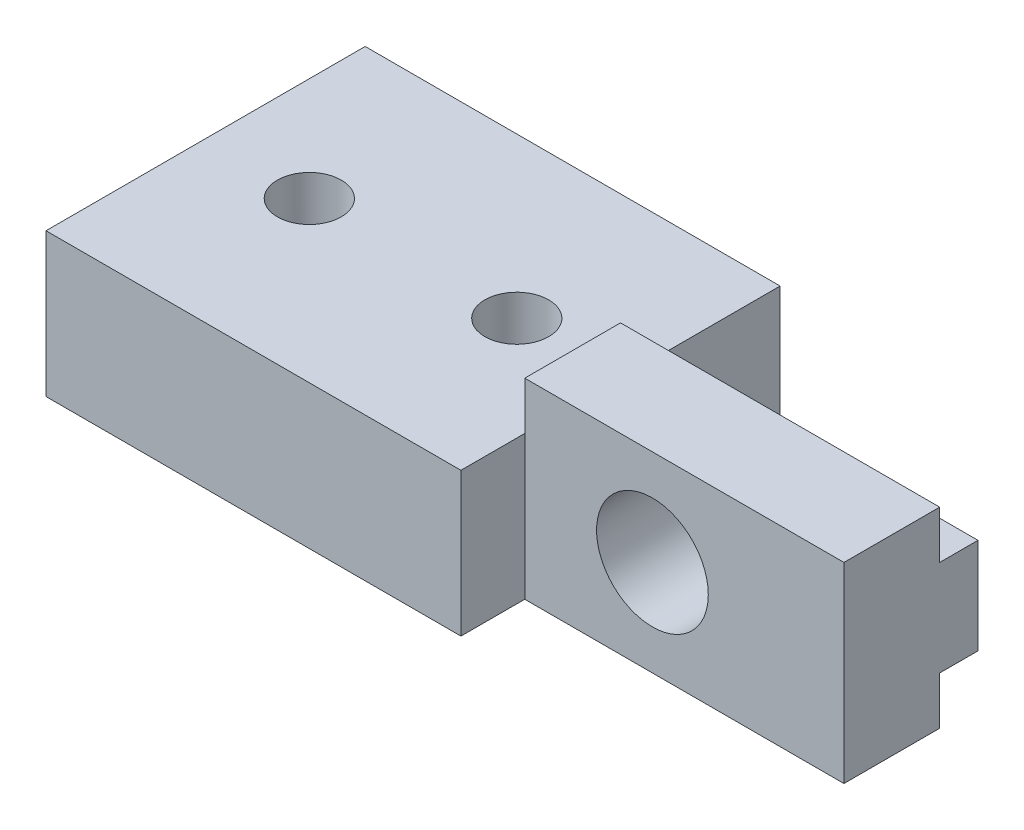
ISO-10303-21;
HEADER;
FILE_DESCRIPTION(('STEP AP214'),'2;1');
FILE_NAME('part.step','',(''),(''),'','','');
FILE_SCHEMA(('AUTOMOTIVE_DESIGN { 1 0 10303 214 1 1 1 1 }'));
ENDSEC;
DATA;
#1=APPLICATION_CONTEXT('core data for automotive mechanical design processes');
#2=APPLICATION_PROTOCOL_DEFINITION('international standard','automotive_design',2000,#1);
#3=PRODUCT_CONTEXT('',#1,'mechanical');
#4=PRODUCT('Part','Part','',(#3));
#5=PRODUCT_RELATED_PRODUCT_CATEGORY('part','',(#4));
#6=PRODUCT_DEFINITION_FORMATION('','',#4);
#7=PRODUCT_DEFINITION_CONTEXT('part definition',#1,'design');
#8=PRODUCT_DEFINITION('design','',#6,#7);
#9=PRODUCT_DEFINITION_SHAPE('','',#8);
#10=(LENGTH_UNIT() NAMED_UNIT(*) SI_UNIT(.MILLI.,.METRE.));
#11=(NAMED_UNIT(*) PLANE_ANGLE_UNIT() SI_UNIT($,.RADIAN.));
#12=(NAMED_UNIT(*) SI_UNIT($,.STERADIAN.) SOLID_ANGLE_UNIT());
#13=UNCERTAINTY_MEASURE_WITH_UNIT(LENGTH_MEASURE(1.E-05),#10,'distance_accuracy_value','');
#14=(GEOMETRIC_REPRESENTATION_CONTEXT(3) GLOBAL_UNCERTAINTY_ASSIGNED_CONTEXT((#13)) GLOBAL_UNIT_ASSIGNED_CONTEXT((#10,
#11,#12)) REPRESENTATION_CONTEXT('',''));
#15=CARTESIAN_POINT('',(0.,0.,0.));
#16=DIRECTION('',(0.,0.,1.));
#17=DIRECTION('',(1.,0.,0.));
#18=AXIS2_PLACEMENT_3D('',#15,#16,#17);
#19=CARTESIAN_POINT('',(16.5,1.5,-1.2));
#20=DIRECTION('',(0.,1.,0.));
#21=DIRECTION('',(0.,0.,1.));
#22=AXIS2_PLACEMENT_3D('',#19,#20,#21);
#23=PLANE('',#22);
#24=DIRECTION('',(-1.,0.,0.));
#25=VECTOR('',#24,1.);
#26=CARTESIAN_POINT('',(16.5,1.5,-1.2));
#27=LINE('',#26,#25);
#28=CARTESIAN_POINT('',(9.598612181134,1.5,-1.2));
#29=VERTEX_POINT('',#28);
#30=CARTESIAN_POINT('',(6.5,1.5,-1.2));
#31=VERTEX_POINT('',#30);
#32=EDGE_CURVE('E63',#29,#31,#27,.T.);
#33=ORIENTED_EDGE('',*,*,#32,.F.);
#34=DIRECTION('',(0.,0.,1.));
#35=VECTOR('',#34,1.);
#36=CARTESIAN_POINT('',(9.598612181134,1.5,-5.));
#37=LINE('',#36,#35);
#38=CARTESIAN_POINT('',(9.598612181134,1.5,0.));
#39=VERTEX_POINT('',#38);
#40=EDGE_CURVE('E321',#29,#39,#37,.T.);
#41=ORIENTED_EDGE('',*,*,#40,.T.);
#42=DIRECTION('',(-1.,0.,0.));
#43=VECTOR('',#42,1.);
#44=CARTESIAN_POINT('',(16.5,1.5,0.));
#45=LINE('',#44,#43);
#46=CARTESIAN_POINT('',(6.5,1.5,0.));
#47=VERTEX_POINT('',#46);
#48=EDGE_CURVE('E257',#39,#47,#45,.T.);
#49=ORIENTED_EDGE('',*,*,#48,.T.);
#50=DIRECTION('',(0.,0.,-1.));
#51=VECTOR('',#50,1.);
#52=CARTESIAN_POINT('',(6.5,1.5,-1.2));
#53=LINE('',#52,#51);
#54=EDGE_CURVE('E285',#47,#31,#53,.T.);
#55=ORIENTED_EDGE('',*,*,#54,.T.);
#56=EDGE_LOOP('',(#33,#41,#49,#55));
#57=FACE_BOUND('',#56,.T.);
#58=ADVANCED_FACE('F39',(#57),#23,.F.);
#59=CARTESIAN_POINT('',(16.5,4.5,-1.2));
#60=DIRECTION('',(0.,0.,1.));
#61=DIRECTION('',(1.,0.,0.));
#62=AXIS2_PLACEMENT_3D('',#59,#60,#61);
#63=PLANE('',#62);
#64=DIRECTION('',(-1.,0.,0.));
#65=VECTOR('',#64,1.);
#66=CARTESIAN_POINT('',(16.5,4.5,-1.2));
#67=LINE('',#66,#65);
#68=CARTESIAN_POINT('',(9.598612181134,4.5,-1.2));
#69=VERTEX_POINT('',#68);
#70=CARTESIAN_POINT('',(6.5,4.5,-1.2));
#71=VERTEX_POINT('',#70);
#72=EDGE_CURVE('E266',#69,#71,#67,.T.);
#73=ORIENTED_EDGE('',*,*,#72,.F.);
#74=CARTESIAN_POINT('',(10.5,3.,-1.2));
#75=DIRECTION('',(0.,0.,1.));
#76=DIRECTION('',(1.,0.,0.));
#77=AXIS2_PLACEMENT_3D('',#74,#75,#76);
#78=CIRCLE('',#77,1.75);
#79=EDGE_CURVE('E329',#69,#29,#78,.T.);
#80=ORIENTED_EDGE('',*,*,#79,.T.);
#81=ORIENTED_EDGE('',*,*,#32,.T.);
#82=DIRECTION('',(0.,1.,0.));
#83=VECTOR('',#82,1.);
#84=CARTESIAN_POINT('',(6.5,4.5,-1.2));
#85=LINE('',#84,#83);
#86=EDGE_CURVE('E282',#31,#71,#85,.T.);
#87=ORIENTED_EDGE('',*,*,#86,.T.);
#88=EDGE_LOOP('',(#73,#80,#81,#87));
#89=FACE_BOUND('',#88,.T.);
#90=ADVANCED_FACE('F399',(#89),#63,.F.);
#91=CARTESIAN_POINT('',(16.5,4.5,0.));
#92=DIRECTION('',(0.,-1.,0.));
#93=DIRECTION('',(0.,0.,-1.));
#94=AXIS2_PLACEMENT_3D('',#91,#92,#93);
#95=PLANE('',#94);
#96=CARTESIAN_POINT('',(16.5,4.5,-1.2));
#97=VERTEX_POINT('',#96);
#98=CARTESIAN_POINT('',(11.401387818866,4.5,-1.2));
#99=VERTEX_POINT('',#98);
#100=EDGE_CURVE('E262',#97,#99,#67,.T.);
#101=ORIENTED_EDGE('',*,*,#100,.T.);
#102=DIRECTION('',(0.,0.,1.));
#103=VECTOR('',#102,1.);
#104=CARTESIAN_POINT('',(11.401387818866,4.5,-5.));
#105=LINE('',#104,#103);
#106=CARTESIAN_POINT('',(11.401387818866,4.5,0.));
#107=VERTEX_POINT('',#106);
#108=EDGE_CURVE('E334',#99,#107,#105,.T.);
#109=ORIENTED_EDGE('',*,*,#108,.T.);
#110=DIRECTION('',(-1.,0.,0.));
#111=VECTOR('',#110,1.);
#112=CARTESIAN_POINT('',(16.5,4.5,0.));
#113=LINE('',#112,#111);
#114=CARTESIAN_POINT('',(16.5,4.5,0.));
#115=VERTEX_POINT('',#114);
#116=EDGE_CURVE('E267',#115,#107,#113,.T.);
#117=ORIENTED_EDGE('',*,*,#116,.F.);
#118=DIRECTION('',(0.,0.,1.));
#119=VECTOR('',#118,1.);
#120=CARTESIAN_POINT('',(16.5,4.5,0.));
#121=LINE('',#120,#119);
#122=EDGE_CURVE('E296',#97,#115,#121,.T.);
#123=ORIENTED_EDGE('',*,*,#122,.F.);
#124=EDGE_LOOP('',(#101,#109,#117,#123));
#125=FACE_BOUND('',#124,.T.);
#126=ADVANCED_FACE('F371',(#125),#95,.F.);
#127=CARTESIAN_POINT('',(6.5,6.,-5.));
#128=DIRECTION('',(-1.,0.,0.));
#129=DIRECTION('',(0.,0.,1.));
#130=AXIS2_PLACEMENT_3D('',#127,#128,#129);
#131=PLANE('',#130);
#132=DIRECTION('',(0.,-1.,0.));
#133=VECTOR('',#132,1.);
#134=CARTESIAN_POINT('',(6.5,6.,-5.));
#135=LINE('',#134,#133);
#136=CARTESIAN_POINT('',(6.5,4.5,-5.));
#137=VERTEX_POINT('',#136);
#138=CARTESIAN_POINT('',(6.5,0.,-5.));
#139=VERTEX_POINT('',#138);
#140=EDGE_CURVE('E49',#137,#139,#135,.T.);
#141=ORIENTED_EDGE('',*,*,#140,.F.);
#142=DIRECTION('',(0.,0.,-1.));
#143=VECTOR('',#142,1.);
#144=CARTESIAN_POINT('',(6.5,4.5,-5.));
#145=LINE('',#144,#143);
#146=EDGE_CURVE('E172',#71,#137,#145,.T.);
#147=ORIENTED_EDGE('',*,*,#146,.F.);
#148=ORIENTED_EDGE('',*,*,#86,.F.);
#149=ORIENTED_EDGE('',*,*,#54,.F.);
#150=DIRECTION('',(0.,1.,0.));
#151=VECTOR('',#150,1.);
#152=CARTESIAN_POINT('',(6.5,1.5,0.));
#153=LINE('',#152,#151);
#154=CARTESIAN_POINT('',(6.5,0.,0.));
#155=VERTEX_POINT('',#154);
#156=EDGE_CURVE('E219',#155,#47,#153,.T.);
#157=ORIENTED_EDGE('',*,*,#156,.F.);
#158=DIRECTION('',(0.,0.,-1.));
#159=VECTOR('',#158,1.);
#160=CARTESIAN_POINT('',(6.5,0.,-5.));
#161=LINE('',#160,#159);
#162=EDGE_CURVE('E216',#155,#139,#161,.T.);
#163=ORIENTED_EDGE('',*,*,#162,.T.);
#164=EDGE_LOOP('',(#141,#147,#148,#149,#157,#163));
#165=FACE_BOUND('',#164,.T.);
#166=ADVANCED_FACE('F41',(#165),#131,.F.);
#167=DIRECTION('',(0.,-1.,0.));
#168=VECTOR('',#167,1.);
#169=CARTESIAN_POINT('',(6.5,0.,3.));
#170=LINE('',#169,#168);
#171=CARTESIAN_POINT('',(6.5,4.5,3.));
#172=VERTEX_POINT('',#171);
#173=CARTESIAN_POINT('',(6.5,0.,3.));
#174=VERTEX_POINT('',#173);
#175=EDGE_CURVE('E180',#172,#174,#170,.T.);
#176=ORIENTED_EDGE('',*,*,#175,.F.);
#177=CARTESIAN_POINT('',(6.5,4.5,5.));
#178=VERTEX_POINT('',#177);
#179=EDGE_CURVE('E164',#178,#172,#145,.T.);
#180=ORIENTED_EDGE('',*,*,#179,.F.);
#181=DIRECTION('',(0.,-1.,0.));
#182=VECTOR('',#181,1.);
#183=CARTESIAN_POINT('',(6.5,6.,5.));
#184=LINE('',#183,#182);
#185=CARTESIAN_POINT('',(6.5,0.,5.));
#186=VERTEX_POINT('',#185);
#187=EDGE_CURVE('E178',#178,#186,#184,.T.);
#188=ORIENTED_EDGE('',*,*,#187,.T.);
#189=EDGE_CURVE('E224',#186,#174,#161,.T.);
#190=ORIENTED_EDGE('',*,*,#189,.T.);
#191=EDGE_LOOP('',(#176,#180,#188,#190));
#192=FACE_BOUND('',#191,.T.);
#193=ADVANCED_FACE('F176',(#192),#131,.F.);
#194=CARTESIAN_POINT('',(0.,6.,0.));
#195=DIRECTION('',(0.,1.,0.));
#196=DIRECTION('',(0.,0.,1.));
#197=AXIS2_PLACEMENT_3D('',#194,#195,#196);
#198=PLANE('',#197);
#199=DIRECTION('',(0.,0.,-1.));
#200=VECTOR('',#199,1.);
#201=CARTESIAN_POINT('',(6.5,6.,-5.));
#202=LINE('',#201,#200);
#203=CARTESIAN_POINT('',(6.5,6.,3.));
#204=VERTEX_POINT('',#203);
#205=CARTESIAN_POINT('',(6.5,6.,0.));
#206=VERTEX_POINT('',#205);
#207=EDGE_CURVE('E173',#204,#206,#202,.T.);
#208=ORIENTED_EDGE('',*,*,#207,.F.);
#209=DIRECTION('',(-1.,0.,0.));
#210=VECTOR('',#209,1.);
#211=CARTESIAN_POINT('',(16.5,6.,3.));
#212=LINE('',#211,#210);
#213=CARTESIAN_POINT('',(16.5,6.,3.));
#214=VERTEX_POINT('',#213);
#215=EDGE_CURVE('E242',#214,#204,#212,.T.);
#216=ORIENTED_EDGE('',*,*,#215,.F.);
#217=DIRECTION('',(0.,0.,1.));
#218=VECTOR('',#217,1.);
#219=CARTESIAN_POINT('',(16.5,6.,3.));
#220=LINE('',#219,#218);
#221=CARTESIAN_POINT('',(16.5,6.,0.));
#222=VERTEX_POINT('',#221);
#223=EDGE_CURVE('E281',#222,#214,#220,.T.);
#224=ORIENTED_EDGE('',*,*,#223,.F.);
#225=DIRECTION('',(-1.,0.,0.));
#226=VECTOR('',#225,1.);
#227=CARTESIAN_POINT('',(16.5,6.,0.));
#228=LINE('',#227,#226);
#229=EDGE_CURVE('E272',#222,#206,#228,.T.);
#230=ORIENTED_EDGE('',*,*,#229,.T.);
#231=EDGE_LOOP('',(#208,#216,#224,#230));
#232=FACE_BOUND('',#231,.T.);
#233=ADVANCED_FACE('F364',(#232),#198,.T.);
#234=CARTESIAN_POINT('',(0.,0.,0.));
#235=DIRECTION('',(0.,1.,0.));
#236=DIRECTION('',(0.,0.,1.));
#237=AXIS2_PLACEMENT_3D('',#234,#235,#236);
#238=PLANE('',#237);
#239=ORIENTED_EDGE('',*,*,#189,.F.);
#240=DIRECTION('',(1.,0.,0.));
#241=VECTOR('',#240,1.);
#242=CARTESIAN_POINT('',(-6.5,0.,5.));
#243=LINE('',#242,#241);
#244=CARTESIAN_POINT('',(-6.5,0.,5.));
#245=VERTEX_POINT('',#244);
#246=EDGE_CURVE('E188',#245,#186,#243,.T.);
#247=ORIENTED_EDGE('',*,*,#246,.F.);
#248=DIRECTION('',(0.,0.,1.));
#249=VECTOR('',#248,1.);
#250=CARTESIAN_POINT('',(-6.5,0.,-5.));
#251=LINE('',#250,#249);
#252=CARTESIAN_POINT('',(-6.5,0.,-5.));
#253=VERTEX_POINT('',#252);
#254=EDGE_CURVE('E197',#253,#245,#251,.T.);
#255=ORIENTED_EDGE('',*,*,#254,.F.);
#256=DIRECTION('',(-1.,0.,0.));
#257=VECTOR('',#256,1.);
#258=CARTESIAN_POINT('',(-6.5,0.,-5.));
#259=LINE('',#258,#257);
#260=EDGE_CURVE('E212',#139,#253,#259,.T.);
#261=ORIENTED_EDGE('',*,*,#260,.F.);
#262=ORIENTED_EDGE('',*,*,#162,.F.);
#263=DIRECTION('',(-1.,0.,0.));
#264=VECTOR('',#263,1.);
#265=CARTESIAN_POINT('',(16.5,0.,0.));
#266=LINE('',#265,#264);
#267=CARTESIAN_POINT('',(16.5,0.,0.));
#268=VERTEX_POINT('',#267);
#269=EDGE_CURVE('E250',#268,#155,#266,.T.);
#270=ORIENTED_EDGE('',*,*,#269,.F.);
#271=DIRECTION('',(0.,0.,-1.));
#272=VECTOR('',#271,1.);
#273=CARTESIAN_POINT('',(16.5,0.,0.));
#274=LINE('',#273,#272);
#275=CARTESIAN_POINT('',(16.5,0.,3.));
#276=VERTEX_POINT('',#275);
#277=EDGE_CURVE('E308',#276,#268,#274,.T.);
#278=ORIENTED_EDGE('',*,*,#277,.F.);
#279=DIRECTION('',(-1.,0.,0.));
#280=VECTOR('',#279,1.);
#281=CARTESIAN_POINT('',(16.5,0.,3.));
#282=LINE('',#281,#280);
#283=EDGE_CURVE('E246',#276,#174,#282,.T.);
#284=ORIENTED_EDGE('',*,*,#283,.T.);
#285=EDGE_LOOP('',(#239,#247,#255,#261,#262,#270,#278,#284));
#286=FACE_BOUND('',#285,.T.);
#287=CARTESIAN_POINT('',(-3.25,0.,0.));
#288=DIRECTION('',(0.,1.,0.));
#289=DIRECTION('',(0.,0.,1.));
#290=AXIS2_PLACEMENT_3D('',#287,#288,#289);
#291=CIRCLE('',#290,1.);
#292=CARTESIAN_POINT('',(-3.25,0.,1.));
#293=VERTEX_POINT('',#292);
#294=EDGE_CURVE('E225',#293,#293,#291,.T.);
#295=ORIENTED_EDGE('',*,*,#294,.T.);
#296=EDGE_LOOP('',(#295));
#297=FACE_BOUND('',#296,.T.);
#298=CARTESIAN_POINT('',(3.25,0.,0.));
#299=DIRECTION('',(0.,1.,0.));
#300=DIRECTION('',(0.,0.,1.));
#301=AXIS2_PLACEMENT_3D('',#298,#299,#300);
#302=CIRCLE('',#301,1.);
#303=CARTESIAN_POINT('',(3.25,0.,0.999999999999999));
#304=VERTEX_POINT('',#303);
#305=EDGE_CURVE('E238',#304,#304,#302,.T.);
#306=ORIENTED_EDGE('',*,*,#305,.T.);
#307=EDGE_LOOP('',(#306));
#308=FACE_BOUND('',#307,.T.);
#309=ADVANCED_FACE('F227',(#286,#297,#308),#238,.F.);
#310=CARTESIAN_POINT('',(-6.5,6.,-5.));
#311=DIRECTION('',(0.,0.,1.));
#312=DIRECTION('',(1.,0.,0.));
#313=AXIS2_PLACEMENT_3D('',#310,#311,#312);
#314=PLANE('',#313);
#315=DIRECTION('',(0.,-1.,0.));
#316=VECTOR('',#315,1.);
#317=CARTESIAN_POINT('',(-6.5,6.,-5.));
#318=LINE('',#317,#316);
#319=CARTESIAN_POINT('',(-6.5,4.5,-5.));
#320=VERTEX_POINT('',#319);
#321=EDGE_CURVE('E195',#320,#253,#318,.T.);
#322=ORIENTED_EDGE('',*,*,#321,.F.);
#323=DIRECTION('',(-1.,0.,0.));
#324=VECTOR('',#323,1.);
#325=CARTESIAN_POINT('',(-6.5,4.5,-5.));
#326=LINE('',#325,#324);
#327=EDGE_CURVE('E183',#137,#320,#326,.T.);
#328=ORIENTED_EDGE('',*,*,#327,.F.);
#329=ORIENTED_EDGE('',*,*,#140,.T.);
#330=ORIENTED_EDGE('',*,*,#260,.T.);
#331=EDGE_LOOP('',(#322,#328,#329,#330));
#332=FACE_BOUND('',#331,.T.);
#333=ADVANCED_FACE('F210',(#332),#314,.F.);
#334=CARTESIAN_POINT('',(-6.5,6.,-5.));
#335=DIRECTION('',(1.,0.,0.));
#336=DIRECTION('',(0.,0.,-1.));
#337=AXIS2_PLACEMENT_3D('',#334,#335,#336);
#338=PLANE('',#337);
#339=DIRECTION('',(0.,-1.,0.));
#340=VECTOR('',#339,1.);
#341=CARTESIAN_POINT('',(-6.5,6.,5.));
#342=LINE('',#341,#340);
#343=CARTESIAN_POINT('',(-6.5,4.5,5.));
#344=VERTEX_POINT('',#343);
#345=EDGE_CURVE('E191',#344,#245,#342,.T.);
#346=ORIENTED_EDGE('',*,*,#345,.F.);
#347=DIRECTION('',(0.,0.,1.));
#348=VECTOR('',#347,1.);
#349=CARTESIAN_POINT('',(-6.5,4.5,-5.));
#350=LINE('',#349,#348);
#351=EDGE_CURVE('E167',#320,#344,#350,.T.);
#352=ORIENTED_EDGE('',*,*,#351,.F.);
#353=ORIENTED_EDGE('',*,*,#321,.T.);
#354=ORIENTED_EDGE('',*,*,#254,.T.);
#355=EDGE_LOOP('',(#346,#352,#353,#354));
#356=FACE_BOUND('',#355,.T.);
#357=ADVANCED_FACE('F436',(#356),#338,.F.);
#358=CARTESIAN_POINT('',(-6.5,6.,5.));
#359=DIRECTION('',(0.,0.,-1.));
#360=DIRECTION('',(-1.,0.,0.));
#361=AXIS2_PLACEMENT_3D('',#358,#359,#360);
#362=PLANE('',#361);
#363=ORIENTED_EDGE('',*,*,#187,.F.);
#364=DIRECTION('',(1.,0.,0.));
#365=VECTOR('',#364,1.);
#366=CARTESIAN_POINT('',(-6.5,4.5,5.));
#367=LINE('',#366,#365);
#368=EDGE_CURVE('E158',#344,#178,#367,.T.);
#369=ORIENTED_EDGE('',*,*,#368,.F.);
#370=ORIENTED_EDGE('',*,*,#345,.T.);
#371=ORIENTED_EDGE('',*,*,#246,.T.);
#372=EDGE_LOOP('',(#363,#369,#370,#371));
#373=FACE_BOUND('',#372,.T.);
#374=ADVANCED_FACE('F186',(#373),#362,.F.);
#375=CARTESIAN_POINT('',(-3.25,6.,0.));
#376=DIRECTION('',(0.,-1.,0.));
#377=DIRECTION('',(0.,0.,-1.));
#378=AXIS2_PLACEMENT_3D('',#375,#376,#377);
#379=CYLINDRICAL_SURFACE('',#378,1.);
#380=CARTESIAN_POINT('',(-3.25,4.5,0.));
#381=DIRECTION('',(0.,-1.,0.));
#382=DIRECTION('',(0.,0.,-1.));
#383=AXIS2_PLACEMENT_3D('',#380,#381,#382);
#384=CIRCLE('',#383,1.);
#385=CARTESIAN_POINT('',(-3.25,4.5,-1.));
#386=VERTEX_POINT('',#385);
#387=EDGE_CURVE('E344',#386,#386,#384,.T.);
#388=ORIENTED_EDGE('',*,*,#387,.F.);
#389=EDGE_LOOP('',(#388));
#390=FACE_BOUND('',#389,.T.);
#391=ORIENTED_EDGE('',*,*,#294,.F.);
#392=EDGE_LOOP('',(#391));
#393=FACE_BOUND('',#392,.T.);
#394=ADVANCED_FACE('F425',(#390,#393),#379,.F.);
#395=CARTESIAN_POINT('',(3.25,6.,0.));
#396=DIRECTION('',(0.,-1.,0.));
#397=DIRECTION('',(0.,0.,-1.));
#398=AXIS2_PLACEMENT_3D('',#395,#396,#397);
#399=CYLINDRICAL_SURFACE('',#398,1.);
#400=CARTESIAN_POINT('',(3.25,4.5,0.));
#401=DIRECTION('',(0.,-1.,0.));
#402=DIRECTION('',(0.,0.,-1.));
#403=AXIS2_PLACEMENT_3D('',#400,#401,#402);
#404=CIRCLE('',#403,1.);
#405=CARTESIAN_POINT('',(3.25,4.5,-1.));
#406=VERTEX_POINT('',#405);
#407=EDGE_CURVE('E43',#406,#406,#404,.T.);
#408=ORIENTED_EDGE('',*,*,#407,.F.);
#409=EDGE_LOOP('',(#408));
#410=FACE_BOUND('',#409,.T.);
#411=ORIENTED_EDGE('',*,*,#305,.F.);
#412=EDGE_LOOP('',(#411));
#413=FACE_BOUND('',#412,.T.);
#414=ADVANCED_FACE('F421',(#410,#413),#399,.F.);
#415=CARTESIAN_POINT('',(16.5,0.,3.));
#416=DIRECTION('',(0.,0.,-1.));
#417=DIRECTION('',(-1.,0.,0.));
#418=AXIS2_PLACEMENT_3D('',#415,#416,#417);
#419=PLANE('',#418);
#420=CARTESIAN_POINT('',(10.5,3.,3.));
#421=DIRECTION('',(0.,0.,1.));
#422=DIRECTION('',(1.,0.,0.));
#423=AXIS2_PLACEMENT_3D('',#420,#421,#422);
#424=CIRCLE('',#423,1.75);
#425=CARTESIAN_POINT('',(12.25,3.,3.));
#426=VERTEX_POINT('',#425);
#427=EDGE_CURVE('E340',#426,#426,#424,.T.);
#428=ORIENTED_EDGE('',*,*,#427,.F.);
#429=EDGE_LOOP('',(#428));
#430=FACE_BOUND('',#429,.T.);
#431=EDGE_CURVE('E291',#204,#172,#170,.T.);
#432=ORIENTED_EDGE('',*,*,#431,.T.);
#433=ORIENTED_EDGE('',*,*,#175,.T.);
#434=ORIENTED_EDGE('',*,*,#283,.F.);
#435=DIRECTION('',(0.,-1.,0.));
#436=VECTOR('',#435,1.);
#437=CARTESIAN_POINT('',(16.5,0.,3.));
#438=LINE('',#437,#436);
#439=EDGE_CURVE('E311',#214,#276,#438,.T.);
#440=ORIENTED_EDGE('',*,*,#439,.F.);
#441=ORIENTED_EDGE('',*,*,#215,.T.);
#442=EDGE_LOOP('',(#432,#433,#434,#440,#441));
#443=FACE_BOUND('',#442,.T.);
#444=ADVANCED_FACE('F416',(#430,#443),#419,.F.);
#445=CARTESIAN_POINT('',(16.5,1.5,0.));
#446=DIRECTION('',(0.,0.,1.));
#447=DIRECTION('',(0.,-1.,0.));
#448=AXIS2_PLACEMENT_3D('',#445,#446,#447);
#449=PLANE('',#448);
#450=ORIENTED_EDGE('',*,*,#48,.F.);
#451=CARTESIAN_POINT('',(10.5,3.,0.));
#452=DIRECTION('',(0.,0.,1.));
#453=DIRECTION('',(0.,-1.,0.));
#454=AXIS2_PLACEMENT_3D('',#451,#452,#453);
#455=CIRCLE('',#454,1.75);
#456=CARTESIAN_POINT('',(11.401387818866,1.5,0.));
#457=VERTEX_POINT('',#456);
#458=EDGE_CURVE('E317',#39,#457,#455,.T.);
#459=ORIENTED_EDGE('',*,*,#458,.T.);
#460=CARTESIAN_POINT('',(16.5,1.5,0.));
#461=VERTEX_POINT('',#460);
#462=EDGE_CURVE('E253',#461,#457,#45,.T.);
#463=ORIENTED_EDGE('',*,*,#462,.F.);
#464=DIRECTION('',(0.,1.,0.));
#465=VECTOR('',#464,1.);
#466=CARTESIAN_POINT('',(16.5,1.5,0.));
#467=LINE('',#466,#465);
#468=EDGE_CURVE('E305',#268,#461,#467,.T.);
#469=ORIENTED_EDGE('',*,*,#468,.F.);
#470=ORIENTED_EDGE('',*,*,#269,.T.);
#471=ORIENTED_EDGE('',*,*,#156,.T.);
#472=EDGE_LOOP('',(#450,#459,#463,#469,#470,#471));
#473=FACE_BOUND('',#472,.T.);
#474=ADVANCED_FACE('F384',(#473),#449,.F.);
#475=ORIENTED_EDGE('',*,*,#462,.T.);
#476=DIRECTION('',(0.,0.,1.));
#477=VECTOR('',#476,1.);
#478=CARTESIAN_POINT('',(11.401387818866,1.5,-5.));
#479=LINE('',#478,#477);
#480=CARTESIAN_POINT('',(11.401387818866,1.5,-1.2));
#481=VERTEX_POINT('',#480);
#482=EDGE_CURVE('E325',#457,#481,#479,.F.);
#483=ORIENTED_EDGE('',*,*,#482,.T.);
#484=CARTESIAN_POINT('',(16.5,1.5,-1.2));
#485=VERTEX_POINT('',#484);
#486=EDGE_CURVE('E258',#485,#481,#27,.T.);
#487=ORIENTED_EDGE('',*,*,#486,.F.);
#488=DIRECTION('',(0.,0.,-1.));
#489=VECTOR('',#488,1.);
#490=CARTESIAN_POINT('',(16.5,1.5,-1.2));
#491=LINE('',#490,#489);
#492=EDGE_CURVE('E302',#461,#485,#491,.T.);
#493=ORIENTED_EDGE('',*,*,#492,.F.);
#494=EDGE_LOOP('',(#475,#483,#487,#493));
#495=FACE_BOUND('',#494,.T.);
#496=ADVANCED_FACE('F380',(#495),#23,.F.);
#497=ORIENTED_EDGE('',*,*,#486,.T.);
#498=EDGE_CURVE('E330',#481,#99,#78,.T.);
#499=ORIENTED_EDGE('',*,*,#498,.T.);
#500=ORIENTED_EDGE('',*,*,#100,.F.);
#501=DIRECTION('',(0.,1.,0.));
#502=VECTOR('',#501,1.);
#503=CARTESIAN_POINT('',(16.5,4.5,-1.2));
#504=LINE('',#503,#502);
#505=EDGE_CURVE('E299',#485,#97,#504,.T.);
#506=ORIENTED_EDGE('',*,*,#505,.F.);
#507=EDGE_LOOP('',(#497,#499,#500,#506));
#508=FACE_BOUND('',#507,.T.);
#509=ADVANCED_FACE('F375',(#508),#63,.F.);
#510=CARTESIAN_POINT('',(9.598612181134,4.5,0.));
#511=VERTEX_POINT('',#510);
#512=CARTESIAN_POINT('',(6.5,4.5,0.));
#513=VERTEX_POINT('',#512);
#514=EDGE_CURVE('E271',#511,#513,#113,.T.);
#515=ORIENTED_EDGE('',*,*,#514,.F.);
#516=DIRECTION('',(0.,0.,1.));
#517=VECTOR('',#516,1.);
#518=CARTESIAN_POINT('',(9.598612181134,4.5,-5.));
#519=LINE('',#518,#517);
#520=EDGE_CURVE('E56',#511,#69,#519,.F.);
#521=ORIENTED_EDGE('',*,*,#520,.T.);
#522=ORIENTED_EDGE('',*,*,#72,.T.);
#523=ORIENTED_EDGE('',*,*,#146,.T.);
#524=ORIENTED_EDGE('',*,*,#327,.T.);
#525=ORIENTED_EDGE('',*,*,#351,.T.);
#526=ORIENTED_EDGE('',*,*,#368,.T.);
#527=ORIENTED_EDGE('',*,*,#179,.T.);
#528=EDGE_CURVE('E184',#172,#513,#145,.T.);
#529=ORIENTED_EDGE('',*,*,#528,.T.);
#530=EDGE_LOOP('',(#515,#521,#522,#523,#524,#525,#526,#527,#529));
#531=FACE_BOUND('',#530,.T.);
#532=ORIENTED_EDGE('',*,*,#387,.T.);
#533=EDGE_LOOP('',(#532));
#534=FACE_BOUND('',#533,.T.);
#535=ORIENTED_EDGE('',*,*,#407,.T.);
#536=EDGE_LOOP('',(#535));
#537=FACE_BOUND('',#536,.T.);
#538=ADVANCED_FACE('F161',(#531,#534,#537),#95,.F.);
#539=CARTESIAN_POINT('',(16.5,6.,0.));
#540=DIRECTION('',(0.,0.,1.));
#541=DIRECTION('',(0.,-1.,0.));
#542=AXIS2_PLACEMENT_3D('',#539,#540,#541);
#543=PLANE('',#542);
#544=ORIENTED_EDGE('',*,*,#116,.T.);
#545=CARTESIAN_POINT('',(10.5,3.,0.));
#546=DIRECTION('',(0.,0.,1.));
#547=DIRECTION('',(0.,-1.,0.));
#548=AXIS2_PLACEMENT_3D('',#545,#546,#547);
#549=CIRCLE('',#548,1.75);
#550=EDGE_CURVE('E11',#107,#511,#549,.T.);
#551=ORIENTED_EDGE('',*,*,#550,.T.);
#552=ORIENTED_EDGE('',*,*,#514,.T.);
#553=DIRECTION('',(0.,1.,0.));
#554=VECTOR('',#553,1.);
#555=CARTESIAN_POINT('',(6.5,6.,0.));
#556=LINE('',#555,#554);
#557=EDGE_CURVE('E277',#513,#206,#556,.T.);
#558=ORIENTED_EDGE('',*,*,#557,.T.);
#559=ORIENTED_EDGE('',*,*,#229,.F.);
#560=DIRECTION('',(0.,1.,0.));
#561=VECTOR('',#560,1.);
#562=CARTESIAN_POINT('',(16.5,6.,0.));
#563=LINE('',#562,#561);
#564=EDGE_CURVE('E276',#115,#222,#563,.T.);
#565=ORIENTED_EDGE('',*,*,#564,.F.);
#566=EDGE_LOOP('',(#544,#551,#552,#558,#559,#565));
#567=FACE_BOUND('',#566,.T.);
#568=ADVANCED_FACE('F361',(#567),#543,.F.);
#569=CARTESIAN_POINT('',(16.5,0.,0.));
#570=DIRECTION('',(-1.,0.,0.));
#571=DIRECTION('',(0.,0.,1.));
#572=AXIS2_PLACEMENT_3D('',#569,#570,#571);
#573=PLANE('',#572);
#574=ORIENTED_EDGE('',*,*,#223,.T.);
#575=ORIENTED_EDGE('',*,*,#439,.T.);
#576=ORIENTED_EDGE('',*,*,#277,.T.);
#577=ORIENTED_EDGE('',*,*,#468,.T.);
#578=ORIENTED_EDGE('',*,*,#492,.T.);
#579=ORIENTED_EDGE('',*,*,#505,.T.);
#580=ORIENTED_EDGE('',*,*,#122,.T.);
#581=ORIENTED_EDGE('',*,*,#564,.T.);
#582=EDGE_LOOP('',(#574,#575,#576,#577,#578,#579,#580,#581));
#583=FACE_BOUND('',#582,.T.);
#584=ADVANCED_FACE('F366',(#583),#573,.F.);
#585=CARTESIAN_POINT('',(10.5,3.,-5.));
#586=DIRECTION('',(0.,0.,1.));
#587=DIRECTION('',(1.,0.,0.));
#588=AXIS2_PLACEMENT_3D('',#585,#586,#587);
#589=CYLINDRICAL_SURFACE('',#588,1.75);
#590=ORIENTED_EDGE('',*,*,#427,.T.);
#591=EDGE_LOOP('',(#590));
#592=FACE_BOUND('',#591,.T.);
#593=ORIENTED_EDGE('',*,*,#40,.F.);
#594=ORIENTED_EDGE('',*,*,#79,.F.);
#595=ORIENTED_EDGE('',*,*,#520,.F.);
#596=ORIENTED_EDGE('',*,*,#550,.F.);
#597=ORIENTED_EDGE('',*,*,#108,.F.);
#598=ORIENTED_EDGE('',*,*,#498,.F.);
#599=ORIENTED_EDGE('',*,*,#482,.F.);
#600=ORIENTED_EDGE('',*,*,#458,.F.);
#601=EDGE_LOOP('',(#593,#594,#595,#596,#597,#598,#599,#600));
#602=FACE_BOUND('',#601,.T.);
#603=ADVANCED_FACE('F373',(#592,#602),#589,.F.);
#604=CARTESIAN_POINT('',(6.5,-11.9012194668567,-5.));
#605=DIRECTION('',(1.,0.,0.));
#606=DIRECTION('',(0.,0.,-1.));
#607=AXIS2_PLACEMENT_3D('',#604,#605,#606);
#608=PLANE('',#607);
#609=ORIENTED_EDGE('',*,*,#207,.T.);
#610=ORIENTED_EDGE('',*,*,#557,.F.);
#611=ORIENTED_EDGE('',*,*,#528,.F.);
#612=ORIENTED_EDGE('',*,*,#431,.F.);
#613=EDGE_LOOP('',(#609,#610,#611,#612));
#614=FACE_BOUND('',#613,.T.);
#615=ADVANCED_FACE('F355',(#614),#608,.F.);
#616=CLOSED_SHELL('',(#58,#90,#126,#166,#193,#233,#309,#333,#357,#374,#394,#414,#444,#474,#496,
#509,#538,#568,#584,#603,#615));
#617=MANIFOLD_SOLID_BREP('B2',#616);
#618=ADVANCED_BREP_SHAPE_REPRESENTATION('',(#18,#617),#14);
#619=SHAPE_DEFINITION_REPRESENTATION(#9,#618);
ENDSEC;
END-ISO-10303-21;
